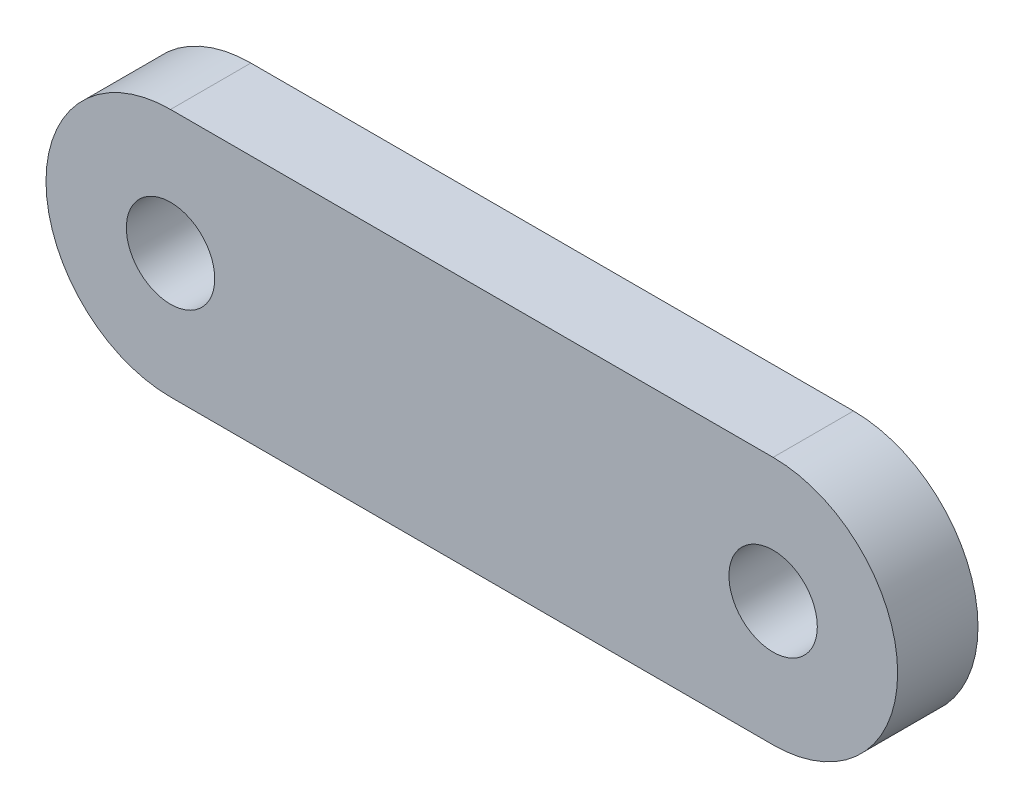
ISO-10303-21;
HEADER;
FILE_DESCRIPTION(('STEP AP214'),'2;1');
FILE_NAME('part.step','',(''),(''),'','','');
FILE_SCHEMA(('AUTOMOTIVE_DESIGN { 1 0 10303 214 1 1 1 1 }'));
ENDSEC;
DATA;
#1=APPLICATION_CONTEXT('core data for automotive mechanical design processes');
#2=APPLICATION_PROTOCOL_DEFINITION('international standard','automotive_design',2000,#1);
#3=PRODUCT_CONTEXT('',#1,'mechanical');
#4=PRODUCT('Part','Part','',(#3));
#5=PRODUCT_RELATED_PRODUCT_CATEGORY('part','',(#4));
#6=PRODUCT_DEFINITION_FORMATION('','',#4);
#7=PRODUCT_DEFINITION_CONTEXT('part definition',#1,'design');
#8=PRODUCT_DEFINITION('design','',#6,#7);
#9=PRODUCT_DEFINITION_SHAPE('','',#8);
#10=(LENGTH_UNIT() NAMED_UNIT(*) SI_UNIT(.MILLI.,.METRE.));
#11=(NAMED_UNIT(*) PLANE_ANGLE_UNIT() SI_UNIT($,.RADIAN.));
#12=(NAMED_UNIT(*) SI_UNIT($,.STERADIAN.) SOLID_ANGLE_UNIT());
#13=UNCERTAINTY_MEASURE_WITH_UNIT(LENGTH_MEASURE(1.E-05),#10,'distance_accuracy_value','');
#14=(GEOMETRIC_REPRESENTATION_CONTEXT(3) GLOBAL_UNCERTAINTY_ASSIGNED_CONTEXT((#13)) GLOBAL_UNIT_ASSIGNED_CONTEXT((#10,
#11,#12)) REPRESENTATION_CONTEXT('',''));
#15=CARTESIAN_POINT('',(0.,0.,0.));
#16=DIRECTION('',(0.,0.,1.));
#17=DIRECTION('',(1.,0.,0.));
#18=AXIS2_PLACEMENT_3D('',#15,#16,#17);
#19=CARTESIAN_POINT('',(11.25,0.,3.));
#20=DIRECTION('',(0.,0.,-1.));
#21=DIRECTION('',(-1.,0.,0.));
#22=AXIS2_PLACEMENT_3D('',#19,#20,#21);
#23=CYLINDRICAL_SURFACE('',#22,4.65);
#24=CARTESIAN_POINT('',(11.25,0.,0.));
#25=DIRECTION('',(0.,0.,1.));
#26=DIRECTION('',(1.,0.,0.));
#27=AXIS2_PLACEMENT_3D('',#24,#25,#26);
#28=CIRCLE('',#27,4.65);
#29=CARTESIAN_POINT('',(11.25,4.65000000000001,0.));
#30=VERTEX_POINT('',#29);
#31=CARTESIAN_POINT('',(11.25,-4.65,0.));
#32=VERTEX_POINT('',#31);
#33=EDGE_CURVE('E105',#30,#32,#28,.F.);
#34=ORIENTED_EDGE('',*,*,#33,.F.);
#35=DIRECTION('',(0.,0.,-1.));
#36=VECTOR('',#35,1.);
#37=CARTESIAN_POINT('',(11.25,4.65000000000001,3.));
#38=LINE('',#37,#36);
#39=CARTESIAN_POINT('',(11.25,4.65000000000001,3.));
#40=VERTEX_POINT('',#39);
#41=EDGE_CURVE('E11',#40,#30,#38,.T.);
#42=ORIENTED_EDGE('',*,*,#41,.F.);
#43=CARTESIAN_POINT('',(11.25,0.,3.));
#44=DIRECTION('',(0.,0.,1.));
#45=DIRECTION('',(1.,0.,0.));
#46=AXIS2_PLACEMENT_3D('',#43,#44,#45);
#47=CIRCLE('',#46,4.65);
#48=CARTESIAN_POINT('',(11.25,-4.65,3.));
#49=VERTEX_POINT('',#48);
#50=EDGE_CURVE('E93',#40,#49,#47,.F.);
#51=ORIENTED_EDGE('',*,*,#50,.T.);
#52=DIRECTION('',(0.,0.,-1.));
#53=VECTOR('',#52,1.);
#54=CARTESIAN_POINT('',(11.25,-4.65,3.));
#55=LINE('',#54,#53);
#56=EDGE_CURVE('E73',#49,#32,#55,.T.);
#57=ORIENTED_EDGE('',*,*,#56,.T.);
#58=EDGE_LOOP('',(#34,#42,#51,#57));
#59=FACE_BOUND('',#58,.T.);
#60=ADVANCED_FACE('F35',(#59),#23,.T.);
#61=CARTESIAN_POINT('',(0.,4.65,3.));
#62=DIRECTION('',(0.,1.,0.));
#63=DIRECTION('',(-1.,0.,0.));
#64=AXIS2_PLACEMENT_3D('',#61,#62,#63);
#65=PLANE('',#64);
#66=DIRECTION('',(1.,0.,0.));
#67=VECTOR('',#66,1.);
#68=CARTESIAN_POINT('',(0.,4.65,0.));
#69=LINE('',#68,#67);
#70=CARTESIAN_POINT('',(-11.25,4.65,0.));
#71=VERTEX_POINT('',#70);
#72=EDGE_CURVE('E86',#71,#30,#69,.T.);
#73=ORIENTED_EDGE('',*,*,#72,.F.);
#74=DIRECTION('',(0.,0.,-1.));
#75=VECTOR('',#74,1.);
#76=CARTESIAN_POINT('',(-11.25,4.65,3.));
#77=LINE('',#76,#75);
#78=CARTESIAN_POINT('',(-11.25,4.65,3.));
#79=VERTEX_POINT('',#78);
#80=EDGE_CURVE('E43',#79,#71,#77,.T.);
#81=ORIENTED_EDGE('',*,*,#80,.F.);
#82=DIRECTION('',(1.,0.,0.));
#83=VECTOR('',#82,1.);
#84=CARTESIAN_POINT('',(0.,4.65,3.));
#85=LINE('',#84,#83);
#86=EDGE_CURVE('E84',#79,#40,#85,.T.);
#87=ORIENTED_EDGE('',*,*,#86,.T.);
#88=ORIENTED_EDGE('',*,*,#41,.T.);
#89=EDGE_LOOP('',(#73,#81,#87,#88));
#90=FACE_BOUND('',#89,.T.);
#91=ADVANCED_FACE('F82',(#90),#65,.T.);
#92=CARTESIAN_POINT('',(-11.25,0.,3.));
#93=DIRECTION('',(0.,0.,-1.));
#94=DIRECTION('',(-1.,0.,0.));
#95=AXIS2_PLACEMENT_3D('',#92,#93,#94);
#96=CYLINDRICAL_SURFACE('',#95,4.65);
#97=CARTESIAN_POINT('',(-11.25,0.,0.));
#98=DIRECTION('',(0.,0.,1.));
#99=DIRECTION('',(1.,0.,0.));
#100=AXIS2_PLACEMENT_3D('',#97,#98,#99);
#101=CIRCLE('',#100,4.65);
#102=CARTESIAN_POINT('',(-11.25,-4.65,0.));
#103=VERTEX_POINT('',#102);
#104=EDGE_CURVE('E66',#71,#103,#101,.T.);
#105=ORIENTED_EDGE('',*,*,#104,.T.);
#106=DIRECTION('',(0.,0.,-1.));
#107=VECTOR('',#106,1.);
#108=CARTESIAN_POINT('',(-11.25,-4.65,3.));
#109=LINE('',#108,#107);
#110=CARTESIAN_POINT('',(-11.25,-4.65,3.));
#111=VERTEX_POINT('',#110);
#112=EDGE_CURVE('E87',#111,#103,#109,.T.);
#113=ORIENTED_EDGE('',*,*,#112,.F.);
#114=CARTESIAN_POINT('',(-11.25,0.,3.));
#115=DIRECTION('',(0.,0.,1.));
#116=DIRECTION('',(1.,0.,0.));
#117=AXIS2_PLACEMENT_3D('',#114,#115,#116);
#118=CIRCLE('',#117,4.65);
#119=EDGE_CURVE('E88',#79,#111,#118,.T.);
#120=ORIENTED_EDGE('',*,*,#119,.F.);
#121=ORIENTED_EDGE('',*,*,#80,.T.);
#122=EDGE_LOOP('',(#105,#113,#120,#121));
#123=FACE_BOUND('',#122,.T.);
#124=ADVANCED_FACE('F89',(#123),#96,.T.);
#125=CARTESIAN_POINT('',(-11.25,0.,3.));
#126=DIRECTION('',(0.,0.,-1.));
#127=DIRECTION('',(-1.,0.,0.));
#128=AXIS2_PLACEMENT_3D('',#125,#126,#127);
#129=CYLINDRICAL_SURFACE('',#128,1.65);
#130=CARTESIAN_POINT('',(-11.25,0.,3.));
#131=DIRECTION('',(0.,0.,1.));
#132=DIRECTION('',(1.,0.,0.));
#133=AXIS2_PLACEMENT_3D('',#130,#131,#132);
#134=CIRCLE('',#133,1.65);
#135=CARTESIAN_POINT('',(-9.6,0.,3.));
#136=VERTEX_POINT('',#135);
#137=EDGE_CURVE('E99',#136,#136,#134,.T.);
#138=ORIENTED_EDGE('',*,*,#137,.T.);
#139=EDGE_LOOP('',(#138));
#140=FACE_BOUND('',#139,.T.);
#141=CARTESIAN_POINT('',(-11.25,0.,0.));
#142=DIRECTION('',(0.,0.,1.));
#143=DIRECTION('',(1.,0.,0.));
#144=AXIS2_PLACEMENT_3D('',#141,#142,#143);
#145=CIRCLE('',#144,1.65);
#146=CARTESIAN_POINT('',(-9.6,0.,0.));
#147=VERTEX_POINT('',#146);
#148=EDGE_CURVE('E112',#147,#147,#145,.T.);
#149=ORIENTED_EDGE('',*,*,#148,.F.);
#150=EDGE_LOOP('',(#149));
#151=FACE_BOUND('',#150,.T.);
#152=ADVANCED_FACE('F131',(#140,#151),#129,.F.);
#153=CARTESIAN_POINT('',(0.,-4.65,3.));
#154=DIRECTION('',(0.,1.,0.));
#155=DIRECTION('',(0.,0.,1.));
#156=AXIS2_PLACEMENT_3D('',#153,#154,#155);
#157=PLANE('',#156);
#158=DIRECTION('',(1.,0.,0.));
#159=VECTOR('',#158,1.);
#160=CARTESIAN_POINT('',(0.,-4.65,0.));
#161=LINE('',#160,#159);
#162=EDGE_CURVE('E110',#103,#32,#161,.T.);
#163=ORIENTED_EDGE('',*,*,#162,.T.);
#164=ORIENTED_EDGE('',*,*,#56,.F.);
#165=DIRECTION('',(1.,0.,0.));
#166=VECTOR('',#165,1.);
#167=CARTESIAN_POINT('',(0.,-4.65,3.));
#168=LINE('',#167,#166);
#169=EDGE_CURVE('E51',#111,#49,#168,.T.);
#170=ORIENTED_EDGE('',*,*,#169,.F.);
#171=ORIENTED_EDGE('',*,*,#112,.T.);
#172=EDGE_LOOP('',(#163,#164,#170,#171));
#173=FACE_BOUND('',#172,.T.);
#174=ADVANCED_FACE('F120',(#173),#157,.F.);
#175=CARTESIAN_POINT('',(11.25,0.,3.));
#176=DIRECTION('',(0.,0.,-1.));
#177=DIRECTION('',(-1.,0.,0.));
#178=AXIS2_PLACEMENT_3D('',#175,#176,#177);
#179=CYLINDRICAL_SURFACE('',#178,1.65);
#180=CARTESIAN_POINT('',(11.25,0.,3.));
#181=DIRECTION('',(0.,0.,1.));
#182=DIRECTION('',(1.,0.,0.));
#183=AXIS2_PLACEMENT_3D('',#180,#181,#182);
#184=CIRCLE('',#183,1.65);
#185=CARTESIAN_POINT('',(12.9,0.,3.));
#186=VERTEX_POINT('',#185);
#187=EDGE_CURVE('E102',#186,#186,#184,.T.);
#188=ORIENTED_EDGE('',*,*,#187,.T.);
#189=EDGE_LOOP('',(#188));
#190=FACE_BOUND('',#189,.T.);
#191=CARTESIAN_POINT('',(11.25,0.,0.));
#192=DIRECTION('',(0.,0.,1.));
#193=DIRECTION('',(1.,0.,0.));
#194=AXIS2_PLACEMENT_3D('',#191,#192,#193);
#195=CIRCLE('',#194,1.65);
#196=CARTESIAN_POINT('',(12.9,0.,0.));
#197=VERTEX_POINT('',#196);
#198=EDGE_CURVE('E95',#197,#197,#195,.T.);
#199=ORIENTED_EDGE('',*,*,#198,.F.);
#200=EDGE_LOOP('',(#199));
#201=FACE_BOUND('',#200,.T.);
#202=ADVANCED_FACE('F136',(#190,#201),#179,.F.);
#203=CARTESIAN_POINT('',(0.,0.,3.));
#204=DIRECTION('',(0.,0.,1.));
#205=DIRECTION('',(1.,0.,0.));
#206=AXIS2_PLACEMENT_3D('',#203,#204,#205);
#207=PLANE('',#206);
#208=ORIENTED_EDGE('',*,*,#50,.F.);
#209=ORIENTED_EDGE('',*,*,#86,.F.);
#210=ORIENTED_EDGE('',*,*,#119,.T.);
#211=ORIENTED_EDGE('',*,*,#169,.T.);
#212=EDGE_LOOP('',(#208,#209,#210,#211));
#213=FACE_BOUND('',#212,.T.);
#214=ORIENTED_EDGE('',*,*,#137,.F.);
#215=EDGE_LOOP('',(#214));
#216=FACE_BOUND('',#215,.T.);
#217=ORIENTED_EDGE('',*,*,#187,.F.);
#218=EDGE_LOOP('',(#217));
#219=FACE_BOUND('',#218,.T.);
#220=ADVANCED_FACE('F91',(#213,#216,#219),#207,.T.);
#221=CARTESIAN_POINT('',(0.,0.,0.));
#222=DIRECTION('',(0.,0.,1.));
#223=DIRECTION('',(1.,0.,0.));
#224=AXIS2_PLACEMENT_3D('',#221,#222,#223);
#225=PLANE('',#224);
#226=ORIENTED_EDGE('',*,*,#33,.T.);
#227=ORIENTED_EDGE('',*,*,#162,.F.);
#228=ORIENTED_EDGE('',*,*,#104,.F.);
#229=ORIENTED_EDGE('',*,*,#72,.T.);
#230=EDGE_LOOP('',(#226,#227,#228,#229));
#231=FACE_BOUND('',#230,.T.);
#232=ORIENTED_EDGE('',*,*,#148,.T.);
#233=EDGE_LOOP('',(#232));
#234=FACE_BOUND('',#233,.T.);
#235=ORIENTED_EDGE('',*,*,#198,.T.);
#236=EDGE_LOOP('',(#235));
#237=FACE_BOUND('',#236,.T.);
#238=ADVANCED_FACE('F122',(#231,#234,#237),#225,.F.);
#239=CLOSED_SHELL('',(#60,#91,#124,#152,#174,#202,#220,#238));
#240=MANIFOLD_SOLID_BREP('B2',#239);
#241=ADVANCED_BREP_SHAPE_REPRESENTATION('',(#18,#240),#14);
#242=SHAPE_DEFINITION_REPRESENTATION(#9,#241);
ENDSEC;
END-ISO-10303-21;
